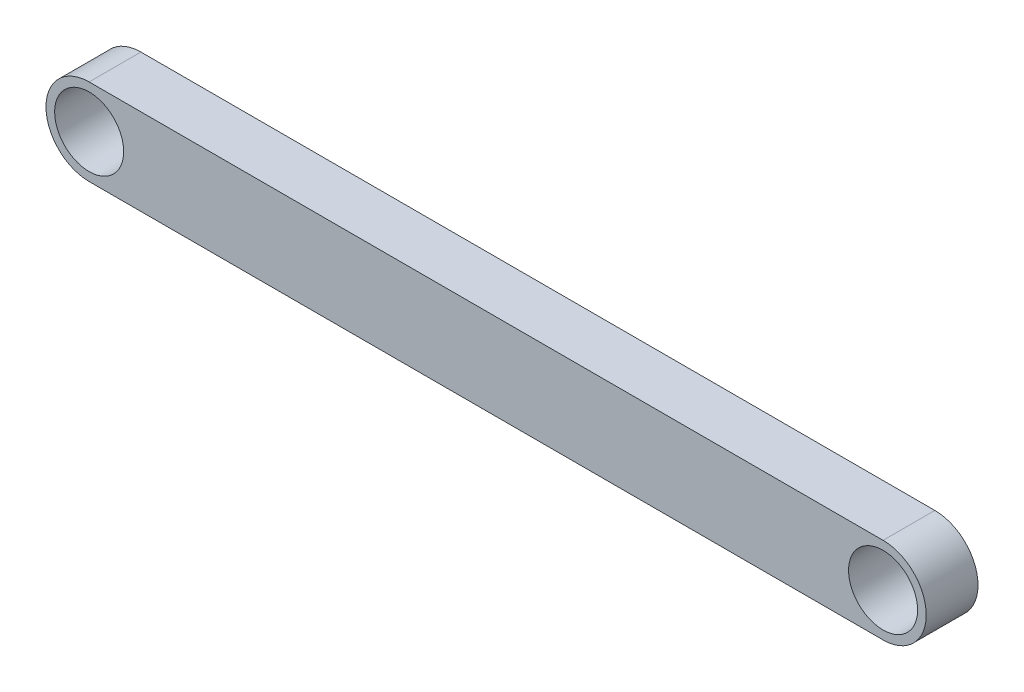
ISO-10303-21;
HEADER;
FILE_DESCRIPTION(('STEP AP214'),'2;1');
FILE_NAME('part.step','',(''),(''),'','','');
FILE_SCHEMA(('AUTOMOTIVE_DESIGN { 1 0 10303 214 1 1 1 1 }'));
ENDSEC;
DATA;
#1=APPLICATION_CONTEXT('core data for automotive mechanical design processes');
#2=APPLICATION_PROTOCOL_DEFINITION('international standard','automotive_design',2000,#1);
#3=PRODUCT_CONTEXT('',#1,'mechanical');
#4=PRODUCT('Part','Part','',(#3));
#5=PRODUCT_RELATED_PRODUCT_CATEGORY('part','',(#4));
#6=PRODUCT_DEFINITION_FORMATION('','',#4);
#7=PRODUCT_DEFINITION_CONTEXT('part definition',#1,'design');
#8=PRODUCT_DEFINITION('design','',#6,#7);
#9=PRODUCT_DEFINITION_SHAPE('','',#8);
#10=(LENGTH_UNIT() NAMED_UNIT(*) SI_UNIT(.MILLI.,.METRE.));
#11=(NAMED_UNIT(*) PLANE_ANGLE_UNIT() SI_UNIT($,.RADIAN.));
#12=(NAMED_UNIT(*) SI_UNIT($,.STERADIAN.) SOLID_ANGLE_UNIT());
#13=UNCERTAINTY_MEASURE_WITH_UNIT(LENGTH_MEASURE(1.E-05),#10,'distance_accuracy_value','');
#14=(GEOMETRIC_REPRESENTATION_CONTEXT(3) GLOBAL_UNCERTAINTY_ASSIGNED_CONTEXT((#13)) GLOBAL_UNIT_ASSIGNED_CONTEXT((#10,
#11,#12)) REPRESENTATION_CONTEXT('',''));
#15=CARTESIAN_POINT('',(0.,0.,0.));
#16=DIRECTION('',(0.,0.,1.));
#17=DIRECTION('',(1.,0.,0.));
#18=AXIS2_PLACEMENT_3D('',#15,#16,#17);
#19=CARTESIAN_POINT('',(0.,0.,3.));
#20=DIRECTION('',(0.,0.,1.));
#21=DIRECTION('',(1.,0.,0.));
#22=AXIS2_PLACEMENT_3D('',#19,#20,#21);
#23=PLANE('',#22);
#24=CARTESIAN_POINT('',(0.,0.,3.));
#25=DIRECTION('',(0.,0.,1.));
#26=DIRECTION('',(1.,0.,0.));
#27=AXIS2_PLACEMENT_3D('',#24,#25,#26);
#28=CIRCLE('',#27,2.);
#29=CARTESIAN_POINT('',(2.,0.,3.));
#30=VERTEX_POINT('',#29);
#31=EDGE_CURVE('E102',#30,#30,#28,.T.);
#32=ORIENTED_EDGE('',*,*,#31,.F.);
#33=EDGE_LOOP('',(#32));
#34=FACE_BOUND('',#33,.T.);
#35=CARTESIAN_POINT('',(0.,0.,3.));
#36=DIRECTION('',(0.,0.,1.));
#37=DIRECTION('',(1.,0.,0.));
#38=AXIS2_PLACEMENT_3D('',#35,#36,#37);
#39=CIRCLE('',#38,2.5);
#40=CARTESIAN_POINT('',(0.,-2.5,3.));
#41=VERTEX_POINT('',#40);
#42=CARTESIAN_POINT('',(0.,2.5,3.));
#43=VERTEX_POINT('',#42);
#44=EDGE_CURVE('E87',#41,#43,#39,.T.);
#45=ORIENTED_EDGE('',*,*,#44,.T.);
#46=DIRECTION('',(-1.,0.,0.));
#47=VECTOR('',#46,1.);
#48=CARTESIAN_POINT('',(0.,2.5,3.));
#49=LINE('',#48,#47);
#50=CARTESIAN_POINT('',(-46.,2.49999999999999,3.));
#51=VERTEX_POINT('',#50);
#52=EDGE_CURVE('E82',#43,#51,#49,.T.);
#53=ORIENTED_EDGE('',*,*,#52,.T.);
#54=CARTESIAN_POINT('',(-46.,0.,3.));
#55=DIRECTION('',(0.,0.,1.));
#56=DIRECTION('',(-1.,0.,0.));
#57=AXIS2_PLACEMENT_3D('',#54,#55,#56);
#58=CIRCLE('',#57,2.5);
#59=CARTESIAN_POINT('',(-46.,-2.5,3.));
#60=VERTEX_POINT('',#59);
#61=EDGE_CURVE('E85',#51,#60,#58,.T.);
#62=ORIENTED_EDGE('',*,*,#61,.T.);
#63=DIRECTION('',(1.,0.,0.));
#64=VECTOR('',#63,1.);
#65=CARTESIAN_POINT('',(-46.,-2.5,3.));
#66=LINE('',#65,#64);
#67=EDGE_CURVE('E52',#60,#41,#66,.T.);
#68=ORIENTED_EDGE('',*,*,#67,.T.);
#69=EDGE_LOOP('',(#45,#53,#62,#68));
#70=FACE_BOUND('',#69,.T.);
#71=CARTESIAN_POINT('',(-46.,0.,3.));
#72=DIRECTION('',(0.,0.,1.));
#73=DIRECTION('',(-1.,0.,0.));
#74=AXIS2_PLACEMENT_3D('',#71,#72,#73);
#75=CIRCLE('',#74,2.);
#76=CARTESIAN_POINT('',(-48.,0.,3.));
#77=VERTEX_POINT('',#76);
#78=EDGE_CURVE('E117',#77,#77,#75,.T.);
#79=ORIENTED_EDGE('',*,*,#78,.F.);
#80=EDGE_LOOP('',(#79));
#81=FACE_BOUND('',#80,.T.);
#82=ADVANCED_FACE('F35',(#34,#70,#81),#23,.T.);
#83=CARTESIAN_POINT('',(0.,0.,0.));
#84=DIRECTION('',(0.,0.,1.));
#85=DIRECTION('',(1.,0.,0.));
#86=AXIS2_PLACEMENT_3D('',#83,#84,#85);
#87=PLANE('',#86);
#88=CARTESIAN_POINT('',(0.,0.,0.));
#89=DIRECTION('',(0.,0.,1.));
#90=DIRECTION('',(1.,0.,0.));
#91=AXIS2_PLACEMENT_3D('',#88,#89,#90);
#92=CIRCLE('',#91,2.5);
#93=CARTESIAN_POINT('',(0.,-2.5,0.));
#94=VERTEX_POINT('',#93);
#95=CARTESIAN_POINT('',(0.,2.5,0.));
#96=VERTEX_POINT('',#95);
#97=EDGE_CURVE('E99',#94,#96,#92,.T.);
#98=ORIENTED_EDGE('',*,*,#97,.F.);
#99=DIRECTION('',(1.,0.,0.));
#100=VECTOR('',#99,1.);
#101=CARTESIAN_POINT('',(-46.,-2.5,0.));
#102=LINE('',#101,#100);
#103=CARTESIAN_POINT('',(-46.,-2.5,0.));
#104=VERTEX_POINT('',#103);
#105=EDGE_CURVE('E75',#104,#94,#102,.T.);
#106=ORIENTED_EDGE('',*,*,#105,.F.);
#107=CARTESIAN_POINT('',(-46.,0.,0.));
#108=DIRECTION('',(0.,0.,1.));
#109=DIRECTION('',(-1.,0.,0.));
#110=AXIS2_PLACEMENT_3D('',#107,#108,#109);
#111=CIRCLE('',#110,2.5);
#112=CARTESIAN_POINT('',(-46.,2.49999999999999,0.));
#113=VERTEX_POINT('',#112);
#114=EDGE_CURVE('E69',#113,#104,#111,.T.);
#115=ORIENTED_EDGE('',*,*,#114,.F.);
#116=DIRECTION('',(-1.,0.,0.));
#117=VECTOR('',#116,1.);
#118=CARTESIAN_POINT('',(0.,2.5,0.));
#119=LINE('',#118,#117);
#120=EDGE_CURVE('E91',#96,#113,#119,.T.);
#121=ORIENTED_EDGE('',*,*,#120,.F.);
#122=EDGE_LOOP('',(#98,#106,#115,#121));
#123=FACE_BOUND('',#122,.T.);
#124=CARTESIAN_POINT('',(0.,0.,0.));
#125=DIRECTION('',(0.,0.,1.));
#126=DIRECTION('',(1.,0.,0.));
#127=AXIS2_PLACEMENT_3D('',#124,#125,#126);
#128=CIRCLE('',#127,2.);
#129=CARTESIAN_POINT('',(2.,0.,0.));
#130=VERTEX_POINT('',#129);
#131=EDGE_CURVE('E114',#130,#130,#128,.T.);
#132=ORIENTED_EDGE('',*,*,#131,.T.);
#133=EDGE_LOOP('',(#132));
#134=FACE_BOUND('',#133,.T.);
#135=CARTESIAN_POINT('',(-46.,0.,0.));
#136=DIRECTION('',(0.,0.,1.));
#137=DIRECTION('',(-1.,0.,0.));
#138=AXIS2_PLACEMENT_3D('',#135,#136,#137);
#139=CIRCLE('',#138,2.);
#140=CARTESIAN_POINT('',(-48.,0.,0.));
#141=VERTEX_POINT('',#140);
#142=EDGE_CURVE('E120',#141,#141,#139,.T.);
#143=ORIENTED_EDGE('',*,*,#142,.T.);
#144=EDGE_LOOP('',(#143));
#145=FACE_BOUND('',#144,.T.);
#146=ADVANCED_FACE('F110',(#123,#134,#145),#87,.F.);
#147=CARTESIAN_POINT('',(0.,0.,3.));
#148=DIRECTION('',(0.,0.,-1.));
#149=DIRECTION('',(-1.,0.,0.));
#150=AXIS2_PLACEMENT_3D('',#147,#148,#149);
#151=CYLINDRICAL_SURFACE('',#150,2.5);
#152=ORIENTED_EDGE('',*,*,#97,.T.);
#153=DIRECTION('',(0.,0.,-1.));
#154=VECTOR('',#153,1.);
#155=CARTESIAN_POINT('',(0.,2.5,3.));
#156=LINE('',#155,#154);
#157=EDGE_CURVE('E11',#43,#96,#156,.T.);
#158=ORIENTED_EDGE('',*,*,#157,.F.);
#159=ORIENTED_EDGE('',*,*,#44,.F.);
#160=DIRECTION('',(0.,0.,-1.));
#161=VECTOR('',#160,1.);
#162=CARTESIAN_POINT('',(0.,-2.5,3.));
#163=LINE('',#162,#161);
#164=EDGE_CURVE('E95',#41,#94,#163,.T.);
#165=ORIENTED_EDGE('',*,*,#164,.T.);
#166=EDGE_LOOP('',(#152,#158,#159,#165));
#167=FACE_BOUND('',#166,.T.);
#168=ADVANCED_FACE('F37',(#167),#151,.T.);
#169=CARTESIAN_POINT('',(0.,2.5,3.));
#170=DIRECTION('',(0.,-1.,0.));
#171=DIRECTION('',(1.,0.,0.));
#172=AXIS2_PLACEMENT_3D('',#169,#170,#171);
#173=PLANE('',#172);
#174=ORIENTED_EDGE('',*,*,#120,.T.);
#175=DIRECTION('',(0.,0.,-1.));
#176=VECTOR('',#175,1.);
#177=CARTESIAN_POINT('',(-46.,2.49999999999999,3.));
#178=LINE('',#177,#176);
#179=EDGE_CURVE('E44',#51,#113,#178,.T.);
#180=ORIENTED_EDGE('',*,*,#179,.F.);
#181=ORIENTED_EDGE('',*,*,#52,.F.);
#182=ORIENTED_EDGE('',*,*,#157,.T.);
#183=EDGE_LOOP('',(#174,#180,#181,#182));
#184=FACE_BOUND('',#183,.T.);
#185=ADVANCED_FACE('F90',(#184),#173,.F.);
#186=CARTESIAN_POINT('',(-46.,0.,3.));
#187=DIRECTION('',(0.,0.,-1.));
#188=DIRECTION('',(-1.,0.,0.));
#189=AXIS2_PLACEMENT_3D('',#186,#187,#188);
#190=CYLINDRICAL_SURFACE('',#189,2.5);
#191=ORIENTED_EDGE('',*,*,#114,.T.);
#192=DIRECTION('',(0.,0.,-1.));
#193=VECTOR('',#192,1.);
#194=CARTESIAN_POINT('',(-46.,-2.5,3.));
#195=LINE('',#194,#193);
#196=EDGE_CURVE('E92',#60,#104,#195,.T.);
#197=ORIENTED_EDGE('',*,*,#196,.F.);
#198=ORIENTED_EDGE('',*,*,#61,.F.);
#199=ORIENTED_EDGE('',*,*,#179,.T.);
#200=EDGE_LOOP('',(#191,#197,#198,#199));
#201=FACE_BOUND('',#200,.T.);
#202=ADVANCED_FACE('F93',(#201),#190,.T.);
#203=CARTESIAN_POINT('',(-46.,-2.5,3.));
#204=DIRECTION('',(0.,1.,0.));
#205=DIRECTION('',(0.,0.,1.));
#206=AXIS2_PLACEMENT_3D('',#203,#204,#205);
#207=PLANE('',#206);
#208=ORIENTED_EDGE('',*,*,#105,.T.);
#209=ORIENTED_EDGE('',*,*,#164,.F.);
#210=ORIENTED_EDGE('',*,*,#67,.F.);
#211=ORIENTED_EDGE('',*,*,#196,.T.);
#212=EDGE_LOOP('',(#208,#209,#210,#211));
#213=FACE_BOUND('',#212,.T.);
#214=ADVANCED_FACE('F107',(#213),#207,.F.);
#215=CARTESIAN_POINT('',(0.,0.,3.));
#216=DIRECTION('',(0.,0.,-1.));
#217=DIRECTION('',(-1.,0.,0.));
#218=AXIS2_PLACEMENT_3D('',#215,#216,#217);
#219=CYLINDRICAL_SURFACE('',#218,2.);
#220=ORIENTED_EDGE('',*,*,#31,.T.);
#221=EDGE_LOOP('',(#220));
#222=FACE_BOUND('',#221,.T.);
#223=ORIENTED_EDGE('',*,*,#131,.F.);
#224=EDGE_LOOP('',(#223));
#225=FACE_BOUND('',#224,.T.);
#226=ADVANCED_FACE('F137',(#222,#225),#219,.F.);
#227=CARTESIAN_POINT('',(-46.,0.,3.));
#228=DIRECTION('',(0.,0.,-1.));
#229=DIRECTION('',(-1.,0.,0.));
#230=AXIS2_PLACEMENT_3D('',#227,#228,#229);
#231=CYLINDRICAL_SURFACE('',#230,2.);
#232=ORIENTED_EDGE('',*,*,#78,.T.);
#233=EDGE_LOOP('',(#232));
#234=FACE_BOUND('',#233,.T.);
#235=ORIENTED_EDGE('',*,*,#142,.F.);
#236=EDGE_LOOP('',(#235));
#237=FACE_BOUND('',#236,.T.);
#238=ADVANCED_FACE('F126',(#234,#237),#231,.F.);
#239=CLOSED_SHELL('',(#82,#146,#168,#185,#202,#214,#226,#238));
#240=MANIFOLD_SOLID_BREP('B2',#239);
#241=ADVANCED_BREP_SHAPE_REPRESENTATION('',(#18,#240),#14);
#242=SHAPE_DEFINITION_REPRESENTATION(#9,#241);
ENDSEC;
END-ISO-10303-21;
